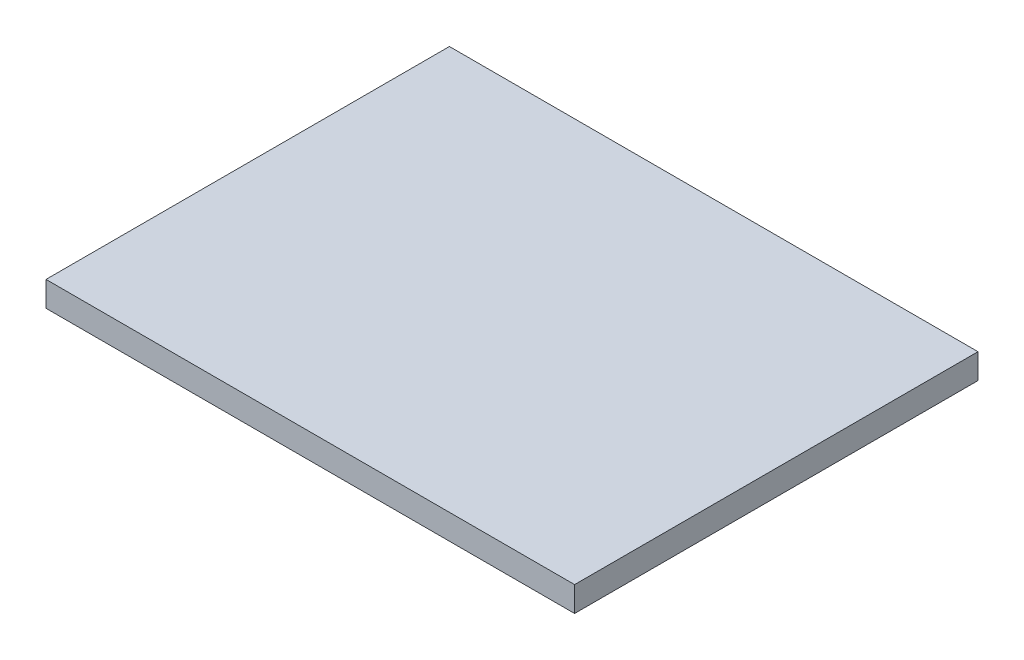
ISO-10303-21;
HEADER;
FILE_DESCRIPTION(('STEP AP214'),'2;1');
FILE_NAME('part.step','',(''),(''),'','','');
FILE_SCHEMA(('AUTOMOTIVE_DESIGN { 1 0 10303 214 1 1 1 1 }'));
ENDSEC;
DATA;
#1=APPLICATION_CONTEXT('core data for automotive mechanical design processes');
#2=APPLICATION_PROTOCOL_DEFINITION('international standard','automotive_design',2000,#1);
#3=PRODUCT_CONTEXT('',#1,'mechanical');
#4=PRODUCT('Part','Part','',(#3));
#5=PRODUCT_RELATED_PRODUCT_CATEGORY('part','',(#4));
#6=PRODUCT_DEFINITION_FORMATION('','',#4);
#7=PRODUCT_DEFINITION_CONTEXT('part definition',#1,'design');
#8=PRODUCT_DEFINITION('design','',#6,#7);
#9=PRODUCT_DEFINITION_SHAPE('','',#8);
#10=(LENGTH_UNIT() NAMED_UNIT(*) SI_UNIT(.MILLI.,.METRE.));
#11=(NAMED_UNIT(*) PLANE_ANGLE_UNIT() SI_UNIT($,.RADIAN.));
#12=(NAMED_UNIT(*) SI_UNIT($,.STERADIAN.) SOLID_ANGLE_UNIT());
#13=UNCERTAINTY_MEASURE_WITH_UNIT(LENGTH_MEASURE(1.E-05),#10,'distance_accuracy_value','');
#14=(GEOMETRIC_REPRESENTATION_CONTEXT(3) GLOBAL_UNCERTAINTY_ASSIGNED_CONTEXT((#13)) GLOBAL_UNIT_ASSIGNED_CONTEXT((#10,
#11,#12)) REPRESENTATION_CONTEXT('',''));
#15=CARTESIAN_POINT('',(0.,0.,0.));
#16=DIRECTION('',(0.,0.,1.));
#17=DIRECTION('',(1.,0.,0.));
#18=AXIS2_PLACEMENT_3D('',#15,#16,#17);
#19=CARTESIAN_POINT('',(190.,18.,145.));
#20=DIRECTION('',(-1.,0.,0.));
#21=DIRECTION('',(0.,0.,1.));
#22=AXIS2_PLACEMENT_3D('',#19,#20,#21);
#23=PLANE('',#22);
#24=DIRECTION('',(0.,0.,-1.));
#25=VECTOR('',#24,1.);
#26=CARTESIAN_POINT('',(190.,0.,145.));
#27=LINE('',#26,#25);
#28=CARTESIAN_POINT('',(190.,0.,145.));
#29=VERTEX_POINT('',#28);
#30=CARTESIAN_POINT('',(190.,0.,-145.));
#31=VERTEX_POINT('',#30);
#32=EDGE_CURVE('E95',#29,#31,#27,.T.);
#33=ORIENTED_EDGE('',*,*,#32,.T.);
#34=DIRECTION('',(0.,-1.,0.));
#35=VECTOR('',#34,1.);
#36=CARTESIAN_POINT('',(190.,18.,-145.));
#37=LINE('',#36,#35);
#38=CARTESIAN_POINT('',(190.,18.,-145.));
#39=VERTEX_POINT('',#38);
#40=EDGE_CURVE('E11',#39,#31,#37,.T.);
#41=ORIENTED_EDGE('',*,*,#40,.F.);
#42=DIRECTION('',(0.,0.,-1.));
#43=VECTOR('',#42,1.);
#44=CARTESIAN_POINT('',(190.,18.,145.));
#45=LINE('',#44,#43);
#46=CARTESIAN_POINT('',(190.,18.,145.));
#47=VERTEX_POINT('',#46);
#48=EDGE_CURVE('E83',#47,#39,#45,.T.);
#49=ORIENTED_EDGE('',*,*,#48,.F.);
#50=DIRECTION('',(0.,-1.,0.));
#51=VECTOR('',#50,1.);
#52=CARTESIAN_POINT('',(190.,18.,145.));
#53=LINE('',#52,#51);
#54=EDGE_CURVE('E91',#47,#29,#53,.T.);
#55=ORIENTED_EDGE('',*,*,#54,.T.);
#56=EDGE_LOOP('',(#33,#41,#49,#55));
#57=FACE_BOUND('',#56,.T.);
#58=ADVANCED_FACE('F32',(#57),#23,.F.);
#59=CARTESIAN_POINT('',(-190.,18.,-145.));
#60=DIRECTION('',(0.,0.,1.));
#61=DIRECTION('',(1.,0.,0.));
#62=AXIS2_PLACEMENT_3D('',#59,#60,#61);
#63=PLANE('',#62);
#64=DIRECTION('',(-1.,0.,0.));
#65=VECTOR('',#64,1.);
#66=CARTESIAN_POINT('',(-190.,0.,-145.));
#67=LINE('',#66,#65);
#68=CARTESIAN_POINT('',(-190.,0.,-145.));
#69=VERTEX_POINT('',#68);
#70=EDGE_CURVE('E87',#31,#69,#67,.T.);
#71=ORIENTED_EDGE('',*,*,#70,.T.);
#72=DIRECTION('',(0.,-1.,0.));
#73=VECTOR('',#72,1.);
#74=CARTESIAN_POINT('',(-190.,18.,-145.));
#75=LINE('',#74,#73);
#76=CARTESIAN_POINT('',(-190.,18.,-145.));
#77=VERTEX_POINT('',#76);
#78=EDGE_CURVE('E40',#77,#69,#75,.T.);
#79=ORIENTED_EDGE('',*,*,#78,.F.);
#80=DIRECTION('',(-1.,0.,0.));
#81=VECTOR('',#80,1.);
#82=CARTESIAN_POINT('',(-190.,18.,-145.));
#83=LINE('',#82,#81);
#84=EDGE_CURVE('E78',#39,#77,#83,.T.);
#85=ORIENTED_EDGE('',*,*,#84,.F.);
#86=ORIENTED_EDGE('',*,*,#40,.T.);
#87=EDGE_LOOP('',(#71,#79,#85,#86));
#88=FACE_BOUND('',#87,.T.);
#89=ADVANCED_FACE('F86',(#88),#63,.F.);
#90=CARTESIAN_POINT('',(-190.,18.,145.));
#91=DIRECTION('',(1.,0.,0.));
#92=DIRECTION('',(0.,0.,-1.));
#93=AXIS2_PLACEMENT_3D('',#90,#91,#92);
#94=PLANE('',#93);
#95=DIRECTION('',(0.,0.,1.));
#96=VECTOR('',#95,1.);
#97=CARTESIAN_POINT('',(-190.,0.,145.));
#98=LINE('',#97,#96);
#99=CARTESIAN_POINT('',(-190.,0.,145.));
#100=VERTEX_POINT('',#99);
#101=EDGE_CURVE('E65',#69,#100,#98,.T.);
#102=ORIENTED_EDGE('',*,*,#101,.T.);
#103=DIRECTION('',(0.,-1.,0.));
#104=VECTOR('',#103,1.);
#105=CARTESIAN_POINT('',(-190.,18.,145.));
#106=LINE('',#105,#104);
#107=CARTESIAN_POINT('',(-190.,18.,145.));
#108=VERTEX_POINT('',#107);
#109=EDGE_CURVE('E88',#108,#100,#106,.T.);
#110=ORIENTED_EDGE('',*,*,#109,.F.);
#111=DIRECTION('',(0.,0.,1.));
#112=VECTOR('',#111,1.);
#113=CARTESIAN_POINT('',(-190.,18.,145.));
#114=LINE('',#113,#112);
#115=EDGE_CURVE('E81',#77,#108,#114,.T.);
#116=ORIENTED_EDGE('',*,*,#115,.F.);
#117=ORIENTED_EDGE('',*,*,#78,.T.);
#118=EDGE_LOOP('',(#102,#110,#116,#117));
#119=FACE_BOUND('',#118,.T.);
#120=ADVANCED_FACE('F89',(#119),#94,.F.);
#121=CARTESIAN_POINT('',(-190.,18.,145.));
#122=DIRECTION('',(0.,0.,-1.));
#123=DIRECTION('',(-1.,0.,0.));
#124=AXIS2_PLACEMENT_3D('',#121,#122,#123);
#125=PLANE('',#124);
#126=DIRECTION('',(1.,0.,0.));
#127=VECTOR('',#126,1.);
#128=CARTESIAN_POINT('',(-190.,0.,145.));
#129=LINE('',#128,#127);
#130=EDGE_CURVE('E71',#100,#29,#129,.T.);
#131=ORIENTED_EDGE('',*,*,#130,.T.);
#132=ORIENTED_EDGE('',*,*,#54,.F.);
#133=DIRECTION('',(1.,0.,0.));
#134=VECTOR('',#133,1.);
#135=CARTESIAN_POINT('',(-190.,18.,145.));
#136=LINE('',#135,#134);
#137=EDGE_CURVE('E48',#108,#47,#136,.T.);
#138=ORIENTED_EDGE('',*,*,#137,.F.);
#139=ORIENTED_EDGE('',*,*,#109,.T.);
#140=EDGE_LOOP('',(#131,#132,#138,#139));
#141=FACE_BOUND('',#140,.T.);
#142=ADVANCED_FACE('F102',(#141),#125,.F.);
#143=CARTESIAN_POINT('',(0.,18.,0.));
#144=DIRECTION('',(0.,-1.,0.));
#145=DIRECTION('',(0.,0.,-1.));
#146=AXIS2_PLACEMENT_3D('',#143,#144,#145);
#147=PLANE('',#146);
#148=ORIENTED_EDGE('',*,*,#48,.T.);
#149=ORIENTED_EDGE('',*,*,#84,.T.);
#150=ORIENTED_EDGE('',*,*,#115,.T.);
#151=ORIENTED_EDGE('',*,*,#137,.T.);
#152=EDGE_LOOP('',(#148,#149,#150,#151));
#153=FACE_BOUND('',#152,.T.);
#154=ADVANCED_FACE('F79',(#153),#147,.F.);
#155=CARTESIAN_POINT('',(0.,0.,0.));
#156=DIRECTION('',(0.,-1.,0.));
#157=DIRECTION('',(0.,0.,-1.));
#158=AXIS2_PLACEMENT_3D('',#155,#156,#157);
#159=PLANE('',#158);
#160=ORIENTED_EDGE('',*,*,#32,.F.);
#161=ORIENTED_EDGE('',*,*,#130,.F.);
#162=ORIENTED_EDGE('',*,*,#101,.F.);
#163=ORIENTED_EDGE('',*,*,#70,.F.);
#164=EDGE_LOOP('',(#160,#161,#162,#163));
#165=FACE_BOUND('',#164,.T.);
#166=ADVANCED_FACE('F105',(#165),#159,.T.);
#167=CLOSED_SHELL('',(#58,#89,#120,#142,#154,#166));
#168=MANIFOLD_SOLID_BREP('B2',#167);
#169=ADVANCED_BREP_SHAPE_REPRESENTATION('',(#18,#168),#14);
#170=SHAPE_DEFINITION_REPRESENTATION(#9,#169);
ENDSEC;
END-ISO-10303-21;
